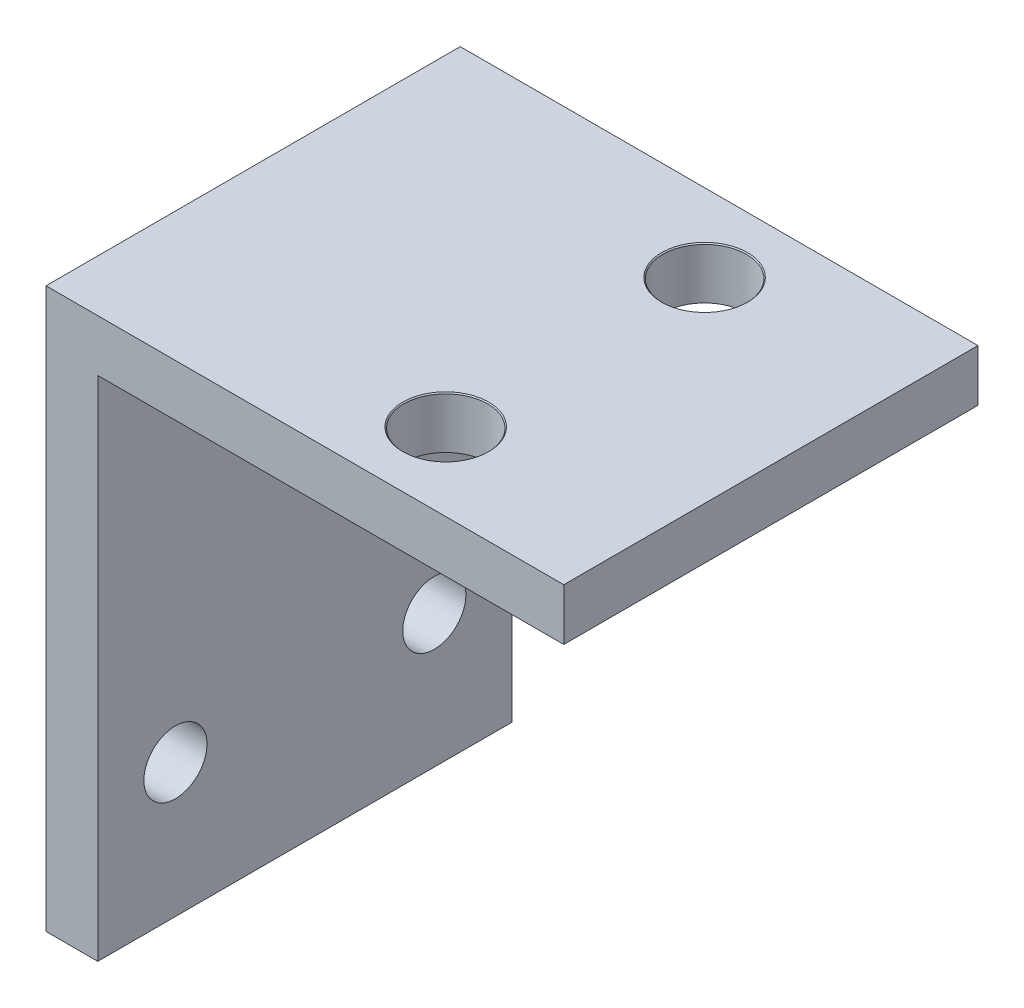
ISO-10303-21;
HEADER;
FILE_DESCRIPTION(('STEP AP214'),'2;1');
FILE_NAME('part.step','',(''),(''),'','','');
FILE_SCHEMA(('AUTOMOTIVE_DESIGN { 1 0 10303 214 1 1 1 1 }'));
ENDSEC;
DATA;
#1=APPLICATION_CONTEXT('core data for automotive mechanical design processes');
#2=APPLICATION_PROTOCOL_DEFINITION('international standard','automotive_design',2000,#1);
#3=PRODUCT_CONTEXT('',#1,'mechanical');
#4=PRODUCT('Part','Part','',(#3));
#5=PRODUCT_RELATED_PRODUCT_CATEGORY('part','',(#4));
#6=PRODUCT_DEFINITION_FORMATION('','',#4);
#7=PRODUCT_DEFINITION_CONTEXT('part definition',#1,'design');
#8=PRODUCT_DEFINITION('design','',#6,#7);
#9=PRODUCT_DEFINITION_SHAPE('','',#8);
#10=(LENGTH_UNIT() NAMED_UNIT(*) SI_UNIT(.MILLI.,.METRE.));
#11=(NAMED_UNIT(*) PLANE_ANGLE_UNIT() SI_UNIT($,.RADIAN.));
#12=(NAMED_UNIT(*) SI_UNIT($,.STERADIAN.) SOLID_ANGLE_UNIT());
#13=UNCERTAINTY_MEASURE_WITH_UNIT(LENGTH_MEASURE(1.E-05),#10,'distance_accuracy_value','');
#14=(GEOMETRIC_REPRESENTATION_CONTEXT(3) GLOBAL_UNCERTAINTY_ASSIGNED_CONTEXT((#13)) GLOBAL_UNIT_ASSIGNED_CONTEXT((#10,
#11,#12)) REPRESENTATION_CONTEXT('',''));
#15=CARTESIAN_POINT('',(0.,0.,0.));
#16=DIRECTION('',(0.,0.,1.));
#17=DIRECTION('',(1.,0.,0.));
#18=AXIS2_PLACEMENT_3D('',#15,#16,#17);
#19=CARTESIAN_POINT('',(31.1628232800643,-49.5043599035237,7.5));
#20=DIRECTION('',(0.,1.,0.));
#21=DIRECTION('',(-1.,0.,0.));
#22=AXIS2_PLACEMENT_3D('',#19,#20,#21);
#23=CYLINDRICAL_SURFACE('',#22,4.05);
#24=CARTESIAN_POINT('',(31.1628232800643,34.1572064619413,7.5));
#25=DIRECTION('',(0.,1.,0.));
#26=DIRECTION('',(1.,0.,0.));
#27=AXIS2_PLACEMENT_3D('',#24,#25,#26);
#28=CIRCLE('',#27,4.05000000005487);
#29=CARTESIAN_POINT('',(35.2128232801192,34.1572064619413,7.5));
#30=VERTEX_POINT('',#29);
#31=EDGE_CURVE('E110',#30,#30,#28,.T.);
#32=ORIENTED_EDGE('',*,*,#31,.T.);
#33=EDGE_LOOP('',(#32));
#34=FACE_BOUND('',#33,.T.);
#35=CARTESIAN_POINT('',(31.1628232800643,29.257206461964,7.5));
#36=DIRECTION('',(0.,1.,0.));
#37=DIRECTION('',(-1.,0.,0.));
#38=AXIS2_PLACEMENT_3D('',#35,#36,#37);
#39=CIRCLE('',#38,4.05);
#40=CARTESIAN_POINT('',(27.1128232800643,29.257206461964,7.5));
#41=VERTEX_POINT('',#40);
#42=EDGE_CURVE('E20',#41,#41,#39,.T.);
#43=ORIENTED_EDGE('',*,*,#42,.F.);
#44=EDGE_LOOP('',(#43));
#45=FACE_BOUND('',#44,.T.);
#46=ADVANCED_FACE('F17',(#34,#45),#23,.F.);
#47=CARTESIAN_POINT('',(31.1628232800643,-49.5043599035237,32.5));
#48=DIRECTION('',(0.,1.,0.));
#49=DIRECTION('',(-1.,0.,0.));
#50=AXIS2_PLACEMENT_3D('',#47,#48,#49);
#51=CYLINDRICAL_SURFACE('',#50,4.05);
#52=CARTESIAN_POINT('',(31.1628232800643,34.1572064619413,32.5));
#53=DIRECTION('',(0.,1.,0.));
#54=DIRECTION('',(1.,0.,0.));
#55=AXIS2_PLACEMENT_3D('',#52,#53,#54);
#56=CIRCLE('',#55,4.05000000005487);
#57=CARTESIAN_POINT('',(35.2128232801192,34.1572064619413,32.5));
#58=VERTEX_POINT('',#57);
#59=EDGE_CURVE('E107',#58,#58,#56,.T.);
#60=ORIENTED_EDGE('',*,*,#59,.T.);
#61=EDGE_LOOP('',(#60));
#62=FACE_BOUND('',#61,.T.);
#63=CARTESIAN_POINT('',(31.1628232800643,29.257206461964,32.5));
#64=DIRECTION('',(0.,1.,0.));
#65=DIRECTION('',(-1.,0.,0.));
#66=AXIS2_PLACEMENT_3D('',#63,#64,#65);
#67=CIRCLE('',#66,4.05);
#68=CARTESIAN_POINT('',(27.1128232800643,29.257206461964,32.5));
#69=VERTEX_POINT('',#68);
#70=EDGE_CURVE('E106',#69,#69,#67,.T.);
#71=ORIENTED_EDGE('',*,*,#70,.F.);
#72=EDGE_LOOP('',(#71));
#73=FACE_BOUND('',#72,.T.);
#74=ADVANCED_FACE('F142',(#62,#73),#51,.F.);
#75=CARTESIAN_POINT('',(31.1628232800643,34.2572064620299,7.5));
#76=DIRECTION('',(0.,1.,0.));
#77=DIRECTION('',(0.,0.,1.));
#78=AXIS2_PLACEMENT_3D('',#75,#76,#77);
#79=CONICAL_SURFACE('',#78,4.14999999997293,0.785398162829014);
#80=ORIENTED_EDGE('',*,*,#31,.F.);
#81=EDGE_LOOP('',(#80));
#82=FACE_BOUND('',#81,.T.);
#83=CARTESIAN_POINT('',(31.1628232800643,34.2572064620299,7.5));
#84=DIRECTION('',(0.,1.,0.));
#85=DIRECTION('',(0.,0.,1.));
#86=AXIS2_PLACEMENT_3D('',#83,#84,#85);
#87=CIRCLE('',#86,4.14999999997293);
#88=CARTESIAN_POINT('',(31.1628232800643,34.2572064620299,11.6499999999729));
#89=VERTEX_POINT('',#88);
#90=EDGE_CURVE('E124',#89,#89,#87,.F.);
#91=ORIENTED_EDGE('',*,*,#90,.F.);
#92=EDGE_LOOP('',(#91));
#93=FACE_BOUND('',#92,.T.);
#94=ADVANCED_FACE('F148',(#82,#93),#79,.F.);
#95=CARTESIAN_POINT('',(31.1628232800643,34.2572064620299,32.5));
#96=DIRECTION('',(0.,1.,0.));
#97=DIRECTION('',(0.,0.,1.));
#98=AXIS2_PLACEMENT_3D('',#95,#96,#97);
#99=CONICAL_SURFACE('',#98,4.14999999997293,0.785398162829014);
#100=ORIENTED_EDGE('',*,*,#59,.F.);
#101=EDGE_LOOP('',(#100));
#102=FACE_BOUND('',#101,.T.);
#103=CARTESIAN_POINT('',(31.1628232800643,34.2572064620299,32.5));
#104=DIRECTION('',(0.,1.,0.));
#105=DIRECTION('',(0.,0.,1.));
#106=AXIS2_PLACEMENT_3D('',#103,#104,#105);
#107=CIRCLE('',#106,4.14999999997293);
#108=CARTESIAN_POINT('',(31.1628232800643,34.2572064620299,36.6499999999729));
#109=VERTEX_POINT('',#108);
#110=EDGE_CURVE('E121',#109,#109,#107,.F.);
#111=ORIENTED_EDGE('',*,*,#110,.F.);
#112=EDGE_LOOP('',(#111));
#113=FACE_BOUND('',#112,.T.);
#114=ADVANCED_FACE('F196',(#102,#113),#99,.F.);
#115=CARTESIAN_POINT('',(50.0628232800643,29.257206461964,0.));
#116=DIRECTION('',(0.,-1.,0.));
#117=DIRECTION('',(0.,0.,-1.));
#118=AXIS2_PLACEMENT_3D('',#115,#116,#117);
#119=PLANE('',#118);
#120=ORIENTED_EDGE('',*,*,#70,.T.);
#121=EDGE_LOOP('',(#120));
#122=FACE_BOUND('',#121,.T.);
#123=ORIENTED_EDGE('',*,*,#42,.T.);
#124=EDGE_LOOP('',(#123));
#125=FACE_BOUND('',#124,.T.);
#126=DIRECTION('',(1.,0.,0.));
#127=VECTOR('',#126,1.);
#128=CARTESIAN_POINT('',(14.4618617416028,29.257206461964,0.));
#129=LINE('',#128,#127);
#130=CARTESIAN_POINT('',(5.06282328006434,29.257206461964,0.));
#131=VERTEX_POINT('',#130);
#132=CARTESIAN_POINT('',(50.0628232800643,29.257206461964,0.));
#133=VERTEX_POINT('',#132);
#134=EDGE_CURVE('E247',#131,#133,#129,.T.);
#135=ORIENTED_EDGE('',*,*,#134,.T.);
#136=DIRECTION('',(0.,0.,-1.));
#137=VECTOR('',#136,1.);
#138=CARTESIAN_POINT('',(50.0628232800643,29.257206461964,0.));
#139=LINE('',#138,#137);
#140=CARTESIAN_POINT('',(50.0628232800643,29.257206461964,40.));
#141=VERTEX_POINT('',#140);
#142=EDGE_CURVE('E72',#141,#133,#139,.T.);
#143=ORIENTED_EDGE('',*,*,#142,.F.);
#144=DIRECTION('',(1.,0.,0.));
#145=VECTOR('',#144,1.);
#146=CARTESIAN_POINT('',(14.4618617416028,29.257206461964,40.));
#147=LINE('',#146,#145);
#148=CARTESIAN_POINT('',(5.06282328006434,29.257206461964,40.));
#149=VERTEX_POINT('',#148);
#150=EDGE_CURVE('E88',#149,#141,#147,.T.);
#151=ORIENTED_EDGE('',*,*,#150,.F.);
#152=DIRECTION('',(0.,0.,-1.));
#153=VECTOR('',#152,1.);
#154=CARTESIAN_POINT('',(5.06282328006434,29.257206461964,0.));
#155=LINE('',#154,#153);
#156=EDGE_CURVE('E77',#131,#149,#155,.F.);
#157=ORIENTED_EDGE('',*,*,#156,.F.);
#158=EDGE_LOOP('',(#135,#143,#151,#157));
#159=FACE_BOUND('',#158,.T.);
#160=ADVANCED_FACE('F89',(#122,#125,#159),#119,.T.);
#161=CARTESIAN_POINT('',(50.0628232800643,34.257206461964,0.));
#162=DIRECTION('',(1.,0.,0.));
#163=DIRECTION('',(0.,0.,-1.));
#164=AXIS2_PLACEMENT_3D('',#161,#162,#163);
#165=PLANE('',#164);
#166=DIRECTION('',(0.,1.,0.));
#167=VECTOR('',#166,1.);
#168=CARTESIAN_POINT('',(50.0628232800643,17.8581680004255,0.));
#169=LINE('',#168,#167);
#170=CARTESIAN_POINT('',(50.0628232800643,34.257206461964,0.));
#171=VERTEX_POINT('',#170);
#172=EDGE_CURVE('E219',#133,#171,#169,.T.);
#173=ORIENTED_EDGE('',*,*,#172,.T.);
#174=DIRECTION('',(0.,0.,1.));
#175=VECTOR('',#174,1.);
#176=CARTESIAN_POINT('',(50.0628232800643,34.257206461964,0.));
#177=LINE('',#176,#175);
#178=CARTESIAN_POINT('',(50.0628232800643,34.257206461964,40.));
#179=VERTEX_POINT('',#178);
#180=EDGE_CURVE('E127',#179,#171,#177,.F.);
#181=ORIENTED_EDGE('',*,*,#180,.F.);
#182=DIRECTION('',(0.,1.,0.));
#183=VECTOR('',#182,1.);
#184=CARTESIAN_POINT('',(50.0628232800643,17.8581680004255,40.));
#185=LINE('',#184,#183);
#186=EDGE_CURVE('E92',#141,#179,#185,.T.);
#187=ORIENTED_EDGE('',*,*,#186,.F.);
#188=ORIENTED_EDGE('',*,*,#142,.T.);
#189=EDGE_LOOP('',(#173,#181,#187,#188));
#190=FACE_BOUND('',#189,.T.);
#191=ADVANCED_FACE('F189',(#190),#165,.T.);
#192=CARTESIAN_POINT('',(5.06282328006434,29.257206461964,0.));
#193=DIRECTION('',(1.,0.,0.));
#194=DIRECTION('',(0.,0.,-1.));
#195=AXIS2_PLACEMENT_3D('',#192,#193,#194);
#196=PLANE('',#195);
#197=CARTESIAN_POINT('',(5.06282328006434,-6.84279353803601,7.5));
#198=DIRECTION('',(-1.,0.,0.));
#199=DIRECTION('',(0.,0.,1.));
#200=AXIS2_PLACEMENT_3D('',#197,#198,#199);
#201=CIRCLE('',#200,3.05);
#202=CARTESIAN_POINT('',(5.06282328006434,-6.84279353803601,10.55));
#203=VERTEX_POINT('',#202);
#204=EDGE_CURVE('E98',#203,#203,#201,.T.);
#205=ORIENTED_EDGE('',*,*,#204,.T.);
#206=EDGE_LOOP('',(#205));
#207=FACE_BOUND('',#206,.T.);
#208=CARTESIAN_POINT('',(5.06282328006434,-6.84279353803601,32.5));
#209=DIRECTION('',(-1.,0.,0.));
#210=DIRECTION('',(0.,0.,1.));
#211=AXIS2_PLACEMENT_3D('',#208,#209,#210);
#212=CIRCLE('',#211,3.05);
#213=CARTESIAN_POINT('',(5.06282328006434,-6.84279353803601,35.55));
#214=VERTEX_POINT('',#213);
#215=EDGE_CURVE('E85',#214,#214,#212,.T.);
#216=ORIENTED_EDGE('',*,*,#215,.T.);
#217=EDGE_LOOP('',(#216));
#218=FACE_BOUND('',#217,.T.);
#219=DIRECTION('',(0.,1.,0.));
#220=VECTOR('',#219,1.);
#221=CARTESIAN_POINT('',(5.06282328006434,17.8581680004255,0.));
#222=LINE('',#221,#220);
#223=CARTESIAN_POINT('',(5.06282328006434,-19.742793538036,0.));
#224=VERTEX_POINT('',#223);
#225=EDGE_CURVE('E83',#224,#131,#222,.T.);
#226=ORIENTED_EDGE('',*,*,#225,.T.);
#227=ORIENTED_EDGE('',*,*,#156,.T.);
#228=DIRECTION('',(0.,1.,0.));
#229=VECTOR('',#228,1.);
#230=CARTESIAN_POINT('',(5.06282328006434,17.8581680004255,40.));
#231=LINE('',#230,#229);
#232=CARTESIAN_POINT('',(5.06282328006434,-19.742793538036,40.));
#233=VERTEX_POINT('',#232);
#234=EDGE_CURVE('E81',#233,#149,#231,.T.);
#235=ORIENTED_EDGE('',*,*,#234,.F.);
#236=DIRECTION('',(0.,0.,-1.));
#237=VECTOR('',#236,1.);
#238=CARTESIAN_POINT('',(5.06282328006434,-19.742793538036,0.));
#239=LINE('',#238,#237);
#240=EDGE_CURVE('E239',#224,#233,#239,.F.);
#241=ORIENTED_EDGE('',*,*,#240,.F.);
#242=EDGE_LOOP('',(#226,#227,#235,#241));
#243=FACE_BOUND('',#242,.T.);
#244=ADVANCED_FACE('F78',(#207,#218,#243),#196,.T.);
#245=CARTESIAN_POINT('',(4.06282328006434,-6.84279353803601,32.5));
#246=DIRECTION('',(-1.,0.,0.));
#247=DIRECTION('',(0.,0.,1.));
#248=AXIS2_PLACEMENT_3D('',#245,#246,#247);
#249=CYLINDRICAL_SURFACE('',#248,3.05);
#250=CARTESIAN_POINT('',(0.16282328010675,-6.84279353803601,32.5));
#251=DIRECTION('',(-1.,0.,0.));
#252=DIRECTION('',(0.,0.,1.));
#253=AXIS2_PLACEMENT_3D('',#250,#251,#252);
#254=CIRCLE('',#253,3.05000000005748);
#255=CARTESIAN_POINT('',(0.16282328010675,-6.84279353803601,35.5500000000575));
#256=VERTEX_POINT('',#255);
#257=EDGE_CURVE('E234',#256,#256,#254,.T.);
#258=ORIENTED_EDGE('',*,*,#257,.T.);
#259=EDGE_LOOP('',(#258));
#260=FACE_BOUND('',#259,.T.);
#261=ORIENTED_EDGE('',*,*,#215,.F.);
#262=EDGE_LOOP('',(#261));
#263=FACE_BOUND('',#262,.T.);
#264=ADVANCED_FACE('F182',(#260,#263),#249,.F.);
#265=CARTESIAN_POINT('',(4.06282328006434,-6.84279353803601,7.5));
#266=DIRECTION('',(-1.,0.,0.));
#267=DIRECTION('',(0.,0.,1.));
#268=AXIS2_PLACEMENT_3D('',#265,#266,#267);
#269=CYLINDRICAL_SURFACE('',#268,3.05);
#270=CARTESIAN_POINT('',(0.162823280163593,-6.84279353803601,7.5));
#271=DIRECTION('',(-1.,0.,0.));
#272=DIRECTION('',(0.,0.,1.));
#273=AXIS2_PLACEMENT_3D('',#270,#271,#272);
#274=CIRCLE('',#273,3.05000000008022);
#275=CARTESIAN_POINT('',(0.162823280163593,-6.84279353803601,10.5500000000802));
#276=VERTEX_POINT('',#275);
#277=EDGE_CURVE('E228',#276,#276,#274,.T.);
#278=ORIENTED_EDGE('',*,*,#277,.T.);
#279=EDGE_LOOP('',(#278));
#280=FACE_BOUND('',#279,.T.);
#281=ORIENTED_EDGE('',*,*,#204,.F.);
#282=EDGE_LOOP('',(#281));
#283=FACE_BOUND('',#282,.T.);
#284=ADVANCED_FACE('F179',(#280,#283),#269,.F.);
#285=CARTESIAN_POINT('',(14.4618617416028,17.8581680004255,40.));
#286=DIRECTION('',(0.,0.,1.));
#287=DIRECTION('',(1.,0.,0.));
#288=AXIS2_PLACEMENT_3D('',#285,#286,#287);
#289=PLANE('',#288);
#290=ORIENTED_EDGE('',*,*,#150,.T.);
#291=ORIENTED_EDGE('',*,*,#186,.T.);
#292=DIRECTION('',(1.,0.,0.));
#293=VECTOR('',#292,1.);
#294=CARTESIAN_POINT('',(0.062823280064339,34.257206461964,40.));
#295=LINE('',#294,#293);
#296=CARTESIAN_POINT('',(0.0628232800643394,34.257206461964,40.));
#297=VERTEX_POINT('',#296);
#298=EDGE_CURVE('E252',#297,#179,#295,.T.);
#299=ORIENTED_EDGE('',*,*,#298,.F.);
#300=DIRECTION('',(0.,1.,0.));
#301=VECTOR('',#300,1.);
#302=CARTESIAN_POINT('',(0.062823280064339,-19.742793538036,40.));
#303=LINE('',#302,#301);
#304=CARTESIAN_POINT('',(0.0628232800643394,-19.742793538036,40.));
#305=VERTEX_POINT('',#304);
#306=EDGE_CURVE('E226',#305,#297,#303,.T.);
#307=ORIENTED_EDGE('',*,*,#306,.F.);
#308=DIRECTION('',(1.,0.,0.));
#309=VECTOR('',#308,1.);
#310=CARTESIAN_POINT('',(5.06282328006434,-19.742793538036,40.));
#311=LINE('',#310,#309);
#312=EDGE_CURVE('E96',#233,#305,#311,.F.);
#313=ORIENTED_EDGE('',*,*,#312,.F.);
#314=ORIENTED_EDGE('',*,*,#234,.T.);
#315=EDGE_LOOP('',(#290,#291,#299,#307,#313,#314));
#316=FACE_BOUND('',#315,.T.);
#317=ADVANCED_FACE('F94',(#316),#289,.T.);
#318=CARTESIAN_POINT('',(0.062823280064339,34.257206461964,0.));
#319=DIRECTION('',(0.,1.,0.));
#320=DIRECTION('',(0.,0.,1.));
#321=AXIS2_PLACEMENT_3D('',#318,#319,#320);
#322=PLANE('',#321);
#323=ORIENTED_EDGE('',*,*,#110,.T.);
#324=EDGE_LOOP('',(#323));
#325=FACE_BOUND('',#324,.T.);
#326=ORIENTED_EDGE('',*,*,#90,.T.);
#327=EDGE_LOOP('',(#326));
#328=FACE_BOUND('',#327,.T.);
#329=DIRECTION('',(1.,0.,0.));
#330=VECTOR('',#329,1.);
#331=CARTESIAN_POINT('',(14.4618617416028,34.257206461964,0.));
#332=LINE('',#331,#330);
#333=CARTESIAN_POINT('',(0.0628232800643392,34.257206461964,0.));
#334=VERTEX_POINT('',#333);
#335=EDGE_CURVE('E212',#171,#334,#332,.F.);
#336=ORIENTED_EDGE('',*,*,#335,.T.);
#337=DIRECTION('',(0.,0.,1.));
#338=VECTOR('',#337,1.);
#339=CARTESIAN_POINT('',(0.062823280064339,34.257206461964,0.));
#340=LINE('',#339,#338);
#341=EDGE_CURVE('E215',#297,#334,#340,.F.);
#342=ORIENTED_EDGE('',*,*,#341,.F.);
#343=ORIENTED_EDGE('',*,*,#298,.T.);
#344=ORIENTED_EDGE('',*,*,#180,.T.);
#345=EDGE_LOOP('',(#336,#342,#343,#344));
#346=FACE_BOUND('',#345,.T.);
#347=ADVANCED_FACE('F173',(#325,#328,#346),#322,.T.);
#348=CARTESIAN_POINT('',(14.4618617416028,17.8581680004255,0.));
#349=DIRECTION('',(0.,0.,1.));
#350=DIRECTION('',(1.,0.,0.));
#351=AXIS2_PLACEMENT_3D('',#348,#349,#350);
#352=PLANE('',#351);
#353=ORIENTED_EDGE('',*,*,#335,.F.);
#354=ORIENTED_EDGE('',*,*,#172,.F.);
#355=ORIENTED_EDGE('',*,*,#134,.F.);
#356=ORIENTED_EDGE('',*,*,#225,.F.);
#357=DIRECTION('',(1.,0.,0.));
#358=VECTOR('',#357,1.);
#359=CARTESIAN_POINT('',(5.06282328006434,-19.742793538036,0.));
#360=LINE('',#359,#358);
#361=CARTESIAN_POINT('',(0.0628232800643394,-19.742793538036,0.));
#362=VERTEX_POINT('',#361);
#363=EDGE_CURVE('E35',#362,#224,#360,.T.);
#364=ORIENTED_EDGE('',*,*,#363,.F.);
#365=DIRECTION('',(0.,1.,0.));
#366=VECTOR('',#365,1.);
#367=CARTESIAN_POINT('',(0.062823280064339,-19.742793538036,0.));
#368=LINE('',#367,#366);
#369=EDGE_CURVE('E222',#334,#362,#368,.F.);
#370=ORIENTED_EDGE('',*,*,#369,.F.);
#371=EDGE_LOOP('',(#353,#354,#355,#356,#364,#370));
#372=FACE_BOUND('',#371,.T.);
#373=ADVANCED_FACE('F169',(#372),#352,.F.);
#374=CARTESIAN_POINT('',(5.06282328006434,-19.742793538036,0.));
#375=DIRECTION('',(0.,-1.,0.));
#376=DIRECTION('',(0.,0.,-1.));
#377=AXIS2_PLACEMENT_3D('',#374,#375,#376);
#378=PLANE('',#377);
#379=ORIENTED_EDGE('',*,*,#363,.T.);
#380=ORIENTED_EDGE('',*,*,#240,.T.);
#381=ORIENTED_EDGE('',*,*,#312,.T.);
#382=DIRECTION('',(0.,0.,1.));
#383=VECTOR('',#382,1.);
#384=CARTESIAN_POINT('',(0.062823280064339,-19.742793538036,0.));
#385=LINE('',#384,#383);
#386=EDGE_CURVE('E120',#362,#305,#385,.T.);
#387=ORIENTED_EDGE('',*,*,#386,.F.);
#388=EDGE_LOOP('',(#379,#380,#381,#387));
#389=FACE_BOUND('',#388,.T.);
#390=ADVANCED_FACE('F165',(#389),#378,.T.);
#391=CARTESIAN_POINT('',(0.0628232800750084,-6.84279353803601,32.5));
#392=DIRECTION('',(-1.,0.,0.));
#393=DIRECTION('',(0.,0.,1.));
#394=AXIS2_PLACEMENT_3D('',#391,#392,#393);
#395=CONICAL_SURFACE('',#394,3.14999999986185,0.785398162544797);
#396=ORIENTED_EDGE('',*,*,#257,.F.);
#397=EDGE_LOOP('',(#396));
#398=FACE_BOUND('',#397,.T.);
#399=CARTESIAN_POINT('',(0.0628232799613215,-6.84279353803601,32.5));
#400=DIRECTION('',(-1.,0.,0.));
#401=DIRECTION('',(0.,0.,1.));
#402=AXIS2_PLACEMENT_3D('',#399,#400,#401);
#403=CIRCLE('',#402,3.14999999997553);
#404=CARTESIAN_POINT('',(0.0628232799613215,-6.84279353803601,35.6499999999755));
#405=VERTEX_POINT('',#404);
#406=EDGE_CURVE('E26',#405,#405,#403,.F.);
#407=ORIENTED_EDGE('',*,*,#406,.F.);
#408=EDGE_LOOP('',(#407));
#409=FACE_BOUND('',#408,.T.);
#410=ADVANCED_FACE('F158',(#398,#409),#395,.F.);
#411=CARTESIAN_POINT('',(0.0628232800750084,-6.84279353803601,7.5));
#412=DIRECTION('',(-1.,0.,0.));
#413=DIRECTION('',(0.,0.,1.));
#414=AXIS2_PLACEMENT_3D('',#411,#412,#413);
#415=CONICAL_SURFACE('',#414,3.14999999999827,0.785398162544797);
#416=ORIENTED_EDGE('',*,*,#277,.F.);
#417=EDGE_LOOP('',(#416));
#418=FACE_BOUND('',#417,.T.);
#419=CARTESIAN_POINT('',(0.0628232800750084,-6.84279353803601,7.5));
#420=DIRECTION('',(-1.,0.,0.));
#421=DIRECTION('',(0.,0.,1.));
#422=AXIS2_PLACEMENT_3D('',#419,#420,#421);
#423=CIRCLE('',#422,3.14999999999827);
#424=CARTESIAN_POINT('',(0.0628232800750084,-6.84279353803601,10.6499999999983));
#425=VERTEX_POINT('',#424);
#426=EDGE_CURVE('E11',#425,#425,#423,.F.);
#427=ORIENTED_EDGE('',*,*,#426,.F.);
#428=EDGE_LOOP('',(#427));
#429=FACE_BOUND('',#428,.T.);
#430=ADVANCED_FACE('F152',(#418,#429),#415,.F.);
#431=CARTESIAN_POINT('',(0.062823280064339,-19.742793538036,0.));
#432=DIRECTION('',(-1.,0.,0.));
#433=DIRECTION('',(0.,0.,1.));
#434=AXIS2_PLACEMENT_3D('',#431,#432,#433);
#435=PLANE('',#434);
#436=ORIENTED_EDGE('',*,*,#426,.T.);
#437=EDGE_LOOP('',(#436));
#438=FACE_BOUND('',#437,.T.);
#439=ORIENTED_EDGE('',*,*,#406,.T.);
#440=EDGE_LOOP('',(#439));
#441=FACE_BOUND('',#440,.T.);
#442=ORIENTED_EDGE('',*,*,#369,.T.);
#443=ORIENTED_EDGE('',*,*,#386,.T.);
#444=ORIENTED_EDGE('',*,*,#306,.T.);
#445=ORIENTED_EDGE('',*,*,#341,.T.);
#446=EDGE_LOOP('',(#442,#443,#444,#445));
#447=FACE_BOUND('',#446,.T.);
#448=ADVANCED_FACE('F150',(#438,#441,#447),#435,.T.);
#449=CLOSED_SHELL('',(#46,#74,#94,#114,#160,#191,#244,#264,#284,#317,#347,#373,#390,#410,#430,#448));
#450=MANIFOLD_SOLID_BREP('B1',#449);
#451=ADVANCED_BREP_SHAPE_REPRESENTATION('',(#18,#450),#14);
#452=SHAPE_DEFINITION_REPRESENTATION(#9,#451);
ENDSEC;
END-ISO-10303-21;
